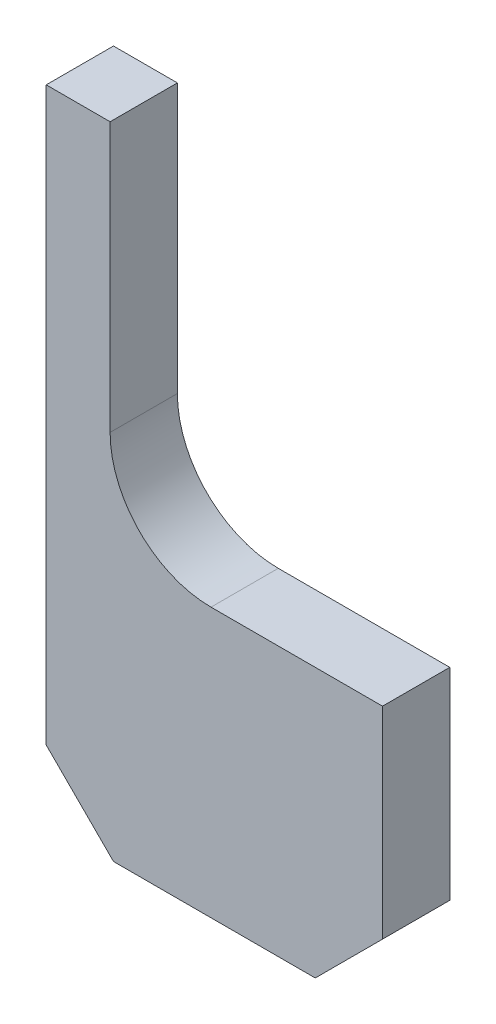
ISO-10303-21;
HEADER;
FILE_DESCRIPTION(('STEP AP214'),'2;1');
FILE_NAME('part.step','',(''),(''),'','','');
FILE_SCHEMA(('AUTOMOTIVE_DESIGN { 1 0 10303 214 1 1 1 1 }'));
ENDSEC;
DATA;
#1=APPLICATION_CONTEXT('core data for automotive mechanical design processes');
#2=APPLICATION_PROTOCOL_DEFINITION('international standard','automotive_design',2000,#1);
#3=PRODUCT_CONTEXT('',#1,'mechanical');
#4=PRODUCT('Part','Part','',(#3));
#5=PRODUCT_RELATED_PRODUCT_CATEGORY('part','',(#4));
#6=PRODUCT_DEFINITION_FORMATION('','',#4);
#7=PRODUCT_DEFINITION_CONTEXT('part definition',#1,'design');
#8=PRODUCT_DEFINITION('design','',#6,#7);
#9=PRODUCT_DEFINITION_SHAPE('','',#8);
#10=(LENGTH_UNIT() NAMED_UNIT(*) SI_UNIT(.MILLI.,.METRE.));
#11=(NAMED_UNIT(*) PLANE_ANGLE_UNIT() SI_UNIT($,.RADIAN.));
#12=(NAMED_UNIT(*) SI_UNIT($,.STERADIAN.) SOLID_ANGLE_UNIT());
#13=UNCERTAINTY_MEASURE_WITH_UNIT(LENGTH_MEASURE(1.E-05),#10,'distance_accuracy_value','');
#14=(GEOMETRIC_REPRESENTATION_CONTEXT(3) GLOBAL_UNCERTAINTY_ASSIGNED_CONTEXT((#13)) GLOBAL_UNIT_ASSIGNED_CONTEXT((#10,
#11,#12)) REPRESENTATION_CONTEXT('',''));
#15=CARTESIAN_POINT('',(0.,0.,0.));
#16=DIRECTION('',(0.,0.,1.));
#17=DIRECTION('',(1.,0.,0.));
#18=AXIS2_PLACEMENT_3D('',#15,#16,#17);
#19=CARTESIAN_POINT('',(0.,-190.,20.));
#20=DIRECTION('',(1.,0.,0.));
#21=DIRECTION('',(0.,0.,-1.));
#22=AXIS2_PLACEMENT_3D('',#19,#20,#21);
#23=PLANE('',#22);
#24=DIRECTION('',(0.,-1.,0.));
#25=VECTOR('',#24,1.);
#26=CARTESIAN_POINT('',(0.,-190.,0.));
#27=LINE('',#26,#25);
#28=CARTESIAN_POINT('',(0.,0.,0.));
#29=VERTEX_POINT('',#28);
#30=CARTESIAN_POINT('',(0.,-170.,0.));
#31=VERTEX_POINT('',#30);
#32=EDGE_CURVE('E142',#29,#31,#27,.T.);
#33=ORIENTED_EDGE('',*,*,#32,.T.);
#34=DIRECTION('',(0.,0.,1.));
#35=VECTOR('',#34,1.);
#36=CARTESIAN_POINT('',(0.,-170.,20.));
#37=LINE('',#36,#35);
#38=CARTESIAN_POINT('',(0.,-170.,20.));
#39=VERTEX_POINT('',#38);
#40=EDGE_CURVE('E11',#31,#39,#37,.T.);
#41=ORIENTED_EDGE('',*,*,#40,.T.);
#42=DIRECTION('',(0.,-1.,0.));
#43=VECTOR('',#42,1.);
#44=CARTESIAN_POINT('',(0.,-190.,20.));
#45=LINE('',#44,#43);
#46=CARTESIAN_POINT('',(0.,0.,20.));
#47=VERTEX_POINT('',#46);
#48=EDGE_CURVE('E155',#47,#39,#45,.T.);
#49=ORIENTED_EDGE('',*,*,#48,.F.);
#50=DIRECTION('',(0.,0.,-1.));
#51=VECTOR('',#50,1.);
#52=CARTESIAN_POINT('',(0.,0.,20.));
#53=LINE('',#52,#51);
#54=EDGE_CURVE('E141',#47,#29,#53,.T.);
#55=ORIENTED_EDGE('',*,*,#54,.T.);
#56=EDGE_LOOP('',(#33,#41,#49,#55));
#57=FACE_BOUND('',#56,.T.);
#58=ADVANCED_FACE('F35',(#57),#23,.F.);
#59=CARTESIAN_POINT('',(100.,-190.,20.));
#60=DIRECTION('',(0.,1.,0.));
#61=DIRECTION('',(-1.,0.,0.));
#62=AXIS2_PLACEMENT_3D('',#59,#60,#61);
#63=PLANE('',#62);
#64=DIRECTION('',(1.,0.,0.));
#65=VECTOR('',#64,1.);
#66=CARTESIAN_POINT('',(100.,-190.,0.));
#67=LINE('',#66,#65);
#68=CARTESIAN_POINT('',(20.,-190.,0.));
#69=VERTEX_POINT('',#68);
#70=CARTESIAN_POINT('',(80.,-190.,0.));
#71=VERTEX_POINT('',#70);
#72=EDGE_CURVE('E144',#69,#71,#67,.T.);
#73=ORIENTED_EDGE('',*,*,#72,.T.);
#74=DIRECTION('',(0.,0.,1.));
#75=VECTOR('',#74,1.);
#76=CARTESIAN_POINT('',(80.,-190.,20.));
#77=LINE('',#76,#75);
#78=CARTESIAN_POINT('',(80.,-190.,20.));
#79=VERTEX_POINT('',#78);
#80=EDGE_CURVE('E56',#71,#79,#77,.T.);
#81=ORIENTED_EDGE('',*,*,#80,.T.);
#82=DIRECTION('',(1.,0.,0.));
#83=VECTOR('',#82,1.);
#84=CARTESIAN_POINT('',(100.,-190.,20.));
#85=LINE('',#84,#83);
#86=CARTESIAN_POINT('',(20.,-190.,20.));
#87=VERTEX_POINT('',#86);
#88=EDGE_CURVE('E117',#87,#79,#85,.T.);
#89=ORIENTED_EDGE('',*,*,#88,.F.);
#90=DIRECTION('',(0.,0.,-1.));
#91=VECTOR('',#90,1.);
#92=CARTESIAN_POINT('',(20.,-190.,20.));
#93=LINE('',#92,#91);
#94=EDGE_CURVE('E170',#87,#69,#93,.T.);
#95=ORIENTED_EDGE('',*,*,#94,.T.);
#96=EDGE_LOOP('',(#73,#81,#89,#95));
#97=FACE_BOUND('',#96,.T.);
#98=ADVANCED_FACE('F178',(#97),#63,.F.);
#99=CARTESIAN_POINT('',(100.,-110.,20.));
#100=DIRECTION('',(-1.,0.,0.));
#101=DIRECTION('',(0.,-1.,0.));
#102=AXIS2_PLACEMENT_3D('',#99,#100,#101);
#103=PLANE('',#102);
#104=DIRECTION('',(0.,1.,0.));
#105=VECTOR('',#104,1.);
#106=CARTESIAN_POINT('',(100.,-110.,20.));
#107=LINE('',#106,#105);
#108=CARTESIAN_POINT('',(100.,-170.,20.));
#109=VERTEX_POINT('',#108);
#110=CARTESIAN_POINT('',(100.,-110.,20.));
#111=VERTEX_POINT('',#110);
#112=EDGE_CURVE('E107',#109,#111,#107,.T.);
#113=ORIENTED_EDGE('',*,*,#112,.F.);
#114=DIRECTION('',(0.,0.,-1.));
#115=VECTOR('',#114,1.);
#116=CARTESIAN_POINT('',(100.,-170.,20.));
#117=LINE('',#116,#115);
#118=CARTESIAN_POINT('',(100.,-170.,0.));
#119=VERTEX_POINT('',#118);
#120=EDGE_CURVE('E126',#109,#119,#117,.T.);
#121=ORIENTED_EDGE('',*,*,#120,.T.);
#122=DIRECTION('',(0.,1.,0.));
#123=VECTOR('',#122,1.);
#124=CARTESIAN_POINT('',(100.,-110.,0.));
#125=LINE('',#124,#123);
#126=CARTESIAN_POINT('',(100.,-110.,0.));
#127=VERTEX_POINT('',#126);
#128=EDGE_CURVE('E123',#119,#127,#125,.T.);
#129=ORIENTED_EDGE('',*,*,#128,.T.);
#130=DIRECTION('',(0.,0.,-1.));
#131=VECTOR('',#130,1.);
#132=CARTESIAN_POINT('',(100.,-110.,20.));
#133=LINE('',#132,#131);
#134=EDGE_CURVE('E120',#111,#127,#133,.T.);
#135=ORIENTED_EDGE('',*,*,#134,.F.);
#136=EDGE_LOOP('',(#113,#121,#129,#135));
#137=FACE_BOUND('',#136,.T.);
#138=ADVANCED_FACE('F121',(#137),#103,.F.);
#139=CARTESIAN_POINT('',(49.0000000000002,-110.,20.));
#140=DIRECTION('',(0.,-1.,0.));
#141=DIRECTION('',(0.,0.,-1.));
#142=AXIS2_PLACEMENT_3D('',#139,#140,#141);
#143=PLANE('',#142);
#144=DIRECTION('',(-1.,0.,0.));
#145=VECTOR('',#144,1.);
#146=CARTESIAN_POINT('',(49.0000000000002,-110.,0.));
#147=LINE('',#146,#145);
#148=CARTESIAN_POINT('',(49.0000000000002,-110.,0.));
#149=VERTEX_POINT('',#148);
#150=EDGE_CURVE('E147',#127,#149,#147,.T.);
#151=ORIENTED_EDGE('',*,*,#150,.T.);
#152=DIRECTION('',(0.,0.,-1.));
#153=VECTOR('',#152,1.);
#154=CARTESIAN_POINT('',(49.0000000000002,-110.,20.));
#155=LINE('',#154,#153);
#156=CARTESIAN_POINT('',(49.0000000000002,-110.,20.));
#157=VERTEX_POINT('',#156);
#158=EDGE_CURVE('E127',#157,#149,#155,.T.);
#159=ORIENTED_EDGE('',*,*,#158,.F.);
#160=DIRECTION('',(-1.,0.,0.));
#161=VECTOR('',#160,1.);
#162=CARTESIAN_POINT('',(49.0000000000002,-110.,20.));
#163=LINE('',#162,#161);
#164=EDGE_CURVE('E111',#111,#157,#163,.T.);
#165=ORIENTED_EDGE('',*,*,#164,.F.);
#166=ORIENTED_EDGE('',*,*,#134,.T.);
#167=EDGE_LOOP('',(#151,#159,#165,#166));
#168=FACE_BOUND('',#167,.T.);
#169=ADVANCED_FACE('F129',(#168),#143,.F.);
#170=CARTESIAN_POINT('',(49.,-80.,20.));
#171=DIRECTION('',(0.,0.,-1.));
#172=DIRECTION('',(-1.,0.,0.));
#173=AXIS2_PLACEMENT_3D('',#170,#171,#172);
#174=CYLINDRICAL_SURFACE('',#173,30.);
#175=CARTESIAN_POINT('',(49.,-80.,0.));
#176=DIRECTION('',(0.,0.,-1.));
#177=DIRECTION('',(1.,0.,0.));
#178=AXIS2_PLACEMENT_3D('',#175,#176,#177);
#179=CIRCLE('',#178,30.);
#180=CARTESIAN_POINT('',(19.,-79.9999999999998,0.));
#181=VERTEX_POINT('',#180);
#182=EDGE_CURVE('E149',#149,#181,#179,.T.);
#183=ORIENTED_EDGE('',*,*,#182,.T.);
#184=DIRECTION('',(0.,0.,-1.));
#185=VECTOR('',#184,1.);
#186=CARTESIAN_POINT('',(19.,-79.9999999999998,20.));
#187=LINE('',#186,#185);
#188=CARTESIAN_POINT('',(19.,-79.9999999999998,20.));
#189=VERTEX_POINT('',#188);
#190=EDGE_CURVE('E161',#189,#181,#187,.T.);
#191=ORIENTED_EDGE('',*,*,#190,.F.);
#192=CARTESIAN_POINT('',(49.,-80.,20.));
#193=DIRECTION('',(0.,0.,-1.));
#194=DIRECTION('',(1.,0.,0.));
#195=AXIS2_PLACEMENT_3D('',#192,#193,#194);
#196=CIRCLE('',#195,30.);
#197=EDGE_CURVE('E132',#157,#189,#196,.T.);
#198=ORIENTED_EDGE('',*,*,#197,.F.);
#199=ORIENTED_EDGE('',*,*,#158,.T.);
#200=EDGE_LOOP('',(#183,#191,#198,#199));
#201=FACE_BOUND('',#200,.T.);
#202=ADVANCED_FACE('F196',(#201),#174,.F.);
#203=CARTESIAN_POINT('',(19.,0.,20.));
#204=DIRECTION('',(-1.,0.,0.));
#205=DIRECTION('',(0.,-1.,0.));
#206=AXIS2_PLACEMENT_3D('',#203,#204,#205);
#207=PLANE('',#206);
#208=DIRECTION('',(0.,1.,0.));
#209=VECTOR('',#208,1.);
#210=CARTESIAN_POINT('',(19.,0.,0.));
#211=LINE('',#210,#209);
#212=CARTESIAN_POINT('',(19.,0.,0.));
#213=VERTEX_POINT('',#212);
#214=EDGE_CURVE('E151',#181,#213,#211,.T.);
#215=ORIENTED_EDGE('',*,*,#214,.T.);
#216=DIRECTION('',(0.,0.,-1.));
#217=VECTOR('',#216,1.);
#218=CARTESIAN_POINT('',(19.,0.,20.));
#219=LINE('',#218,#217);
#220=CARTESIAN_POINT('',(19.,0.,20.));
#221=VERTEX_POINT('',#220);
#222=EDGE_CURVE('E158',#221,#213,#219,.T.);
#223=ORIENTED_EDGE('',*,*,#222,.F.);
#224=DIRECTION('',(0.,1.,0.));
#225=VECTOR('',#224,1.);
#226=CARTESIAN_POINT('',(19.,0.,20.));
#227=LINE('',#226,#225);
#228=EDGE_CURVE('E134',#189,#221,#227,.T.);
#229=ORIENTED_EDGE('',*,*,#228,.F.);
#230=ORIENTED_EDGE('',*,*,#190,.T.);
#231=EDGE_LOOP('',(#215,#223,#229,#230));
#232=FACE_BOUND('',#231,.T.);
#233=ADVANCED_FACE('F192',(#232),#207,.F.);
#234=CARTESIAN_POINT('',(0.,0.,20.));
#235=DIRECTION('',(0.,-1.,0.));
#236=DIRECTION('',(0.,0.,-1.));
#237=AXIS2_PLACEMENT_3D('',#234,#235,#236);
#238=PLANE('',#237);
#239=DIRECTION('',(-1.,0.,0.));
#240=VECTOR('',#239,1.);
#241=CARTESIAN_POINT('',(0.,0.,0.));
#242=LINE('',#241,#240);
#243=EDGE_CURVE('E153',#213,#29,#242,.T.);
#244=ORIENTED_EDGE('',*,*,#243,.T.);
#245=ORIENTED_EDGE('',*,*,#54,.F.);
#246=DIRECTION('',(-1.,0.,0.));
#247=VECTOR('',#246,1.);
#248=CARTESIAN_POINT('',(0.,0.,20.));
#249=LINE('',#248,#247);
#250=EDGE_CURVE('E139',#221,#47,#249,.T.);
#251=ORIENTED_EDGE('',*,*,#250,.F.);
#252=ORIENTED_EDGE('',*,*,#222,.T.);
#253=EDGE_LOOP('',(#244,#245,#251,#252));
#254=FACE_BOUND('',#253,.T.);
#255=ADVANCED_FACE('F187',(#254),#238,.F.);
#256=CARTESIAN_POINT('',(49.,-80.,20.));
#257=DIRECTION('',(0.,0.,1.));
#258=DIRECTION('',(1.,0.,0.));
#259=AXIS2_PLACEMENT_3D('',#256,#257,#258);
#260=PLANE('',#259);
#261=ORIENTED_EDGE('',*,*,#88,.T.);
#262=DIRECTION('',(-0.707106781186549,-0.707106781186546,0.));
#263=VECTOR('',#262,1.);
#264=CARTESIAN_POINT('',(119.5,-150.5,20.));
#265=LINE('',#264,#263);
#266=EDGE_CURVE('E43',#79,#109,#265,.F.);
#267=ORIENTED_EDGE('',*,*,#266,.T.);
#268=ORIENTED_EDGE('',*,*,#112,.T.);
#269=ORIENTED_EDGE('',*,*,#164,.T.);
#270=ORIENTED_EDGE('',*,*,#197,.T.);
#271=ORIENTED_EDGE('',*,*,#228,.T.);
#272=ORIENTED_EDGE('',*,*,#250,.T.);
#273=ORIENTED_EDGE('',*,*,#48,.T.);
#274=DIRECTION('',(-0.707106781186547,0.707106781186549,0.));
#275=VECTOR('',#274,1.);
#276=CARTESIAN_POINT('',(-20.5,-149.5,20.));
#277=LINE('',#276,#275);
#278=EDGE_CURVE('E174',#39,#87,#277,.F.);
#279=ORIENTED_EDGE('',*,*,#278,.T.);
#280=EDGE_LOOP('',(#261,#267,#268,#269,#270,#271,#272,#273,#279));
#281=FACE_BOUND('',#280,.T.);
#282=ADVANCED_FACE('F109',(#281),#260,.T.);
#283=CARTESIAN_POINT('',(49.,-80.,0.));
#284=DIRECTION('',(0.,0.,1.));
#285=DIRECTION('',(1.,0.,0.));
#286=AXIS2_PLACEMENT_3D('',#283,#284,#285);
#287=PLANE('',#286);
#288=ORIENTED_EDGE('',*,*,#128,.F.);
#289=DIRECTION('',(0.707106781186549,0.707106781186546,0.));
#290=VECTOR('',#289,1.);
#291=CARTESIAN_POINT('',(100.,-170.,0.));
#292=LINE('',#291,#290);
#293=EDGE_CURVE('E168',#119,#71,#292,.F.);
#294=ORIENTED_EDGE('',*,*,#293,.T.);
#295=ORIENTED_EDGE('',*,*,#72,.F.);
#296=DIRECTION('',(0.707106781186547,-0.707106781186549,0.));
#297=VECTOR('',#296,1.);
#298=CARTESIAN_POINT('',(20.,-190.,0.));
#299=LINE('',#298,#297);
#300=EDGE_CURVE('E166',#69,#31,#299,.F.);
#301=ORIENTED_EDGE('',*,*,#300,.T.);
#302=ORIENTED_EDGE('',*,*,#32,.F.);
#303=ORIENTED_EDGE('',*,*,#243,.F.);
#304=ORIENTED_EDGE('',*,*,#214,.F.);
#305=ORIENTED_EDGE('',*,*,#182,.F.);
#306=ORIENTED_EDGE('',*,*,#150,.F.);
#307=EDGE_LOOP('',(#288,#294,#295,#301,#302,#303,#304,#305,#306));
#308=FACE_BOUND('',#307,.T.);
#309=ADVANCED_FACE('F182',(#308),#287,.F.);
#310=CARTESIAN_POINT('',(100.,-170.,20.));
#311=DIRECTION('',(-0.707106781186546,0.707106781186549,0.));
#312=DIRECTION('',(0.,0.,-1.));
#313=AXIS2_PLACEMENT_3D('',#310,#311,#312);
#314=PLANE('',#313);
#315=ORIENTED_EDGE('',*,*,#266,.F.);
#316=ORIENTED_EDGE('',*,*,#80,.F.);
#317=ORIENTED_EDGE('',*,*,#293,.F.);
#318=ORIENTED_EDGE('',*,*,#120,.F.);
#319=EDGE_LOOP('',(#315,#316,#317,#318));
#320=FACE_BOUND('',#319,.T.);
#321=ADVANCED_FACE('F212',(#320),#314,.F.);
#322=CARTESIAN_POINT('',(20.,-190.,20.));
#323=DIRECTION('',(0.707106781186549,0.707106781186547,0.));
#324=DIRECTION('',(0.,0.,-1.));
#325=AXIS2_PLACEMENT_3D('',#322,#323,#324);
#326=PLANE('',#325);
#327=ORIENTED_EDGE('',*,*,#278,.F.);
#328=ORIENTED_EDGE('',*,*,#40,.F.);
#329=ORIENTED_EDGE('',*,*,#300,.F.);
#330=ORIENTED_EDGE('',*,*,#94,.F.);
#331=EDGE_LOOP('',(#327,#328,#329,#330));
#332=FACE_BOUND('',#331,.T.);
#333=ADVANCED_FACE('F37',(#332),#326,.F.);
#334=CLOSED_SHELL('',(#58,#98,#138,#169,#202,#233,#255,#282,#309,#321,#333));
#335=MANIFOLD_SOLID_BREP('B2',#334);
#336=ADVANCED_BREP_SHAPE_REPRESENTATION('',(#18,#335),#14);
#337=SHAPE_DEFINITION_REPRESENTATION(#9,#336);
ENDSEC;
END-ISO-10303-21;
